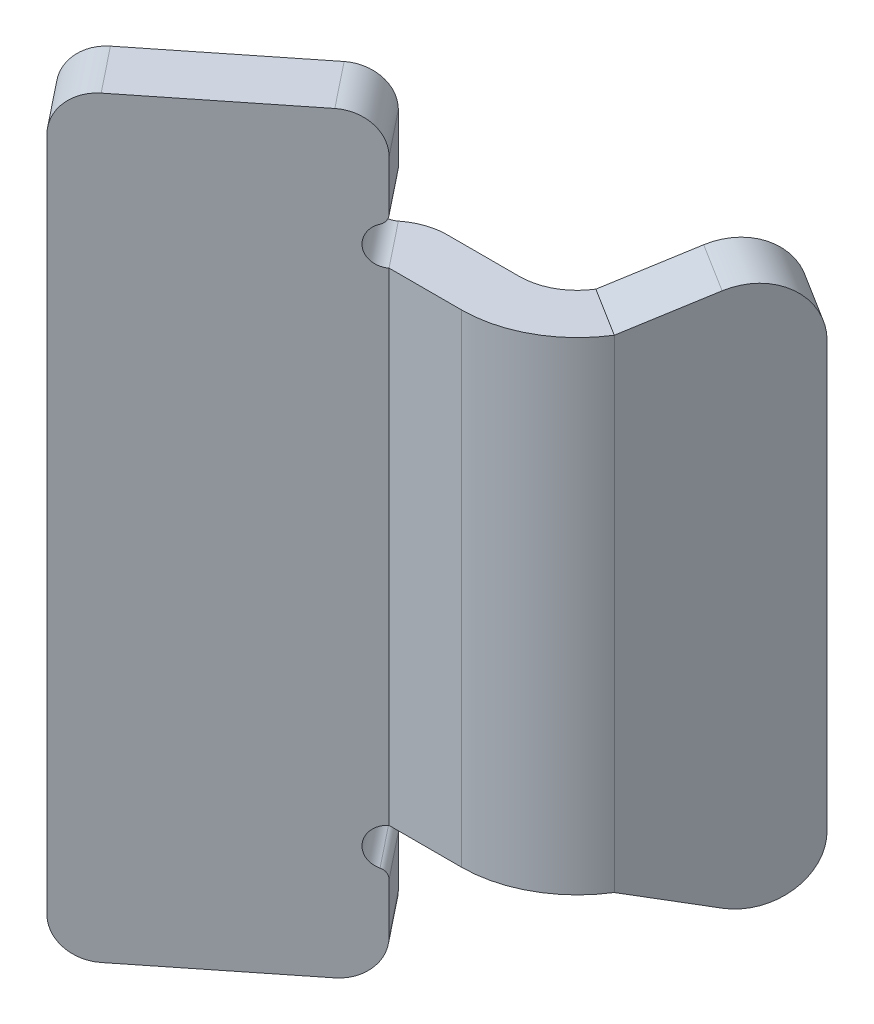
ISO-10303-21;
HEADER;
FILE_DESCRIPTION(('STEP AP214'),'2;1');
FILE_NAME('part.step','',(''),(''),'','','');
FILE_SCHEMA(('AUTOMOTIVE_DESIGN { 1 0 10303 214 1 1 1 1 }'));
ENDSEC;
DATA;
#1=APPLICATION_CONTEXT('core data for automotive mechanical design processes');
#2=APPLICATION_PROTOCOL_DEFINITION('international standard','automotive_design',2000,#1);
#3=PRODUCT_CONTEXT('',#1,'mechanical');
#4=PRODUCT('Part','Part','',(#3));
#5=PRODUCT_RELATED_PRODUCT_CATEGORY('part','',(#4));
#6=PRODUCT_DEFINITION_FORMATION('','',#4);
#7=PRODUCT_DEFINITION_CONTEXT('part definition',#1,'design');
#8=PRODUCT_DEFINITION('design','',#6,#7);
#9=PRODUCT_DEFINITION_SHAPE('','',#8);
#10=(LENGTH_UNIT() NAMED_UNIT(*) SI_UNIT(.MILLI.,.METRE.));
#11=(NAMED_UNIT(*) PLANE_ANGLE_UNIT() SI_UNIT($,.RADIAN.));
#12=(NAMED_UNIT(*) SI_UNIT($,.STERADIAN.) SOLID_ANGLE_UNIT());
#13=UNCERTAINTY_MEASURE_WITH_UNIT(LENGTH_MEASURE(1.E-05),#10,'distance_accuracy_value','');
#14=(GEOMETRIC_REPRESENTATION_CONTEXT(3) GLOBAL_UNCERTAINTY_ASSIGNED_CONTEXT((#13)) GLOBAL_UNIT_ASSIGNED_CONTEXT((#10,
#11,#12)) REPRESENTATION_CONTEXT('',''));
#15=CARTESIAN_POINT('',(0.,0.,0.));
#16=DIRECTION('',(0.,0.,1.));
#17=DIRECTION('',(1.,0.,0.));
#18=AXIS2_PLACEMENT_3D('',#15,#16,#17);
#19=CARTESIAN_POINT('',(-21.75373898583,0.,-38.02220742052));
#20=DIRECTION('',(0.848048096156421,0.,0.529919264233213));
#21=DIRECTION('',(0.529919264233213,0.,-0.848048096156421));
#22=AXIS2_PLACEMENT_3D('',#19,#20,#21);
#23=PLANE('',#22);
#24=CARTESIAN_POINT('',(-41.9818376398863,41.75356883009,-5.65048268757589));
#25=DIRECTION('',(0.848048096156421,0.,0.529919264233213));
#26=DIRECTION('',(0.529919264233213,0.,-0.848048096156421));
#27=AXIS2_PLACEMENT_3D('',#24,#25,#26);
#28=CIRCLE('',#27,3.000000000598);
#29=CARTESIAN_POINT('',(-40.3920798468706,41.75356883009,-8.19462697655104));
#30=VERTEX_POINT('',#29);
#31=CARTESIAN_POINT('',(-42.4830924837084,44.6005423384936,-4.84830725315945));
#32=VERTEX_POINT('',#31);
#33=EDGE_CURVE('E177',#30,#32,#28,.T.);
#34=ORIENTED_EDGE('',*,*,#33,.F.);
#35=DIRECTION('',(0.,1.,0.));
#36=VECTOR('',#35,1.);
#37=CARTESIAN_POINT('',(-40.3920798468714,30.75356883068,-8.19462697654979));
#38=LINE('',#37,#36);
#39=CARTESIAN_POINT('',(-40.3920798468719,19.75356883128,-8.19462697655009));
#40=VERTEX_POINT('',#39);
#41=EDGE_CURVE('E173',#30,#40,#38,.F.);
#42=ORIENTED_EDGE('',*,*,#41,.T.);
#43=CARTESIAN_POINT('',(-41.9818376398873,19.75356883128,-5.6504826875765));
#44=DIRECTION('',(0.848048096156421,0.,0.529919264233213));
#45=DIRECTION('',(0.529919264233213,0.,-0.848048096156421));
#46=AXIS2_PLACEMENT_3D('',#43,#44,#45);
#47=CIRCLE('',#46,3.000000000598);
#48=CARTESIAN_POINT('',(-42.4830924837089,16.9065953228764,-4.8483072531598));
#49=VERTEX_POINT('',#48);
#50=EDGE_CURVE('E20',#49,#40,#47,.T.);
#51=ORIENTED_EDGE('',*,*,#50,.F.);
#52=DIRECTION('',(-0.502888702188584,0.315302649260106,0.804790154376059));
#53=VECTOR('',#52,1.);
#54=CARTESIAN_POINT('',(-42.4830924837105,16.9065953228774,-4.84830725315725));
#55=LINE('',#54,#53);
#56=CARTESIAN_POINT('',(-44.6314339607378,18.2535688306815,-1.41024220730392));
#57=VERTEX_POINT('',#56);
#58=EDGE_CURVE('E168',#49,#57,#55,.T.);
#59=ORIENTED_EDGE('',*,*,#58,.T.);
#60=DIRECTION('',(0.,1.,0.));
#61=VECTOR('',#60,1.);
#62=CARTESIAN_POINT('',(-44.6314339607407,18.25356883068,-1.41024220730043));
#63=LINE('',#62,#61);
#64=CARTESIAN_POINT('',(-44.6314339607458,43.2535688306835,-1.41024220729116));
#65=VERTEX_POINT('',#64);
#66=EDGE_CURVE('E291',#57,#65,#63,.T.);
#67=ORIENTED_EDGE('',*,*,#66,.T.);
#68=DIRECTION('',(0.502888702188584,0.315302649260106,-0.804790154376059));
#69=VECTOR('',#68,1.);
#70=CARTESIAN_POINT('',(-44.6314339607411,43.2535688306863,-1.41024220729822));
#71=LINE('',#70,#69);
#72=EDGE_CURVE('E285',#65,#32,#71,.T.);
#73=ORIENTED_EDGE('',*,*,#72,.T.);
#74=EDGE_LOOP('',(#34,#42,#51,#59,#67,#73));
#75=FACE_BOUND('',#74,.T.);
#76=ADVANCED_FACE('F17',(#75),#23,.F.);
#77=CARTESIAN_POINT('',(-42.28519107799,17.58008207678,-2.334395833879));
#78=DIRECTION('',(0.167084947906703,0.948991169279018,-0.267391811418105));
#79=DIRECTION('',(0.,0.271204264419381,0.962521816355734));
#80=AXIS2_PLACEMENT_3D('',#77,#78,#79);
#81=PLANE('',#80);
#82=DIRECTION('',(0.848048096156421,0.,0.529919264233213));
#83=VECTOR('',#82,1.);
#84=CARTESIAN_POINT('',(-41.2110203394731,16.9065953228774,-4.05342835680583));
#85=LINE('',#84,#83);
#86=CARTESIAN_POINT('',(-39.9389481952388,16.9065953228778,-3.25854946046256));
#87=VERTEX_POINT('',#86);
#88=EDGE_CURVE('E187',#87,#49,#85,.F.);
#89=ORIENTED_EDGE('',*,*,#88,.F.);
#90=DIRECTION('',(0.502888702188366,-0.315302649258903,-0.804790154376666));
#91=VECTOR('',#90,1.);
#92=CARTESIAN_POINT('',(-42.0872896722712,18.25356883068,0.179515585398478));
#93=LINE('',#92,#91);
#94=CARTESIAN_POINT('',(-42.0872896722711,18.25356883068,0.179515585398518));
#95=VERTEX_POINT('',#94);
#96=EDGE_CURVE('E282',#95,#87,#93,.T.);
#97=ORIENTED_EDGE('',*,*,#96,.F.);
#98=DIRECTION('',(-0.848048096156555,0.,-0.529919264232998));
#99=VECTOR('',#98,1.);
#100=CARTESIAN_POINT('',(-42.08728967227,18.25356883068,0.1795155853992));
#101=LINE('',#100,#99);
#102=EDGE_CURVE('E284',#95,#57,#101,.T.);
#103=ORIENTED_EDGE('',*,*,#102,.T.);
#104=ORIENTED_EDGE('',*,*,#58,.F.);
#105=EDGE_LOOP('',(#89,#97,#103,#104));
#106=FACE_BOUND('',#105,.T.);
#107=ADVANCED_FACE('F638',(#106),#81,.F.);
#108=CARTESIAN_POINT('',(-40.70976549565,19.75356883128,-4.855603791225));
#109=DIRECTION('',(0.848048096156421,0.,0.529919264233213));
#110=DIRECTION('',(0.529919264233213,0.,-0.848048096156421));
#111=AXIS2_PLACEMENT_3D('',#108,#109,#110);
#112=CYLINDRICAL_SURFACE('',#111,3.000000000598);
#113=ORIENTED_EDGE('',*,*,#88,.T.);
#114=ORIENTED_EDGE('',*,*,#50,.T.);
#115=DIRECTION('',(0.848048096156421,0.,0.529919264233213));
#116=VECTOR('',#115,1.);
#117=CARTESIAN_POINT('',(-39.12000770264,19.75356883128,-7.399748080202));
#118=LINE('',#117,#116);
#119=CARTESIAN_POINT('',(-37.8479355584032,19.75356883128,-6.60486918385164));
#120=VERTEX_POINT('',#119);
#121=EDGE_CURVE('E181',#40,#120,#118,.T.);
#122=ORIENTED_EDGE('',*,*,#121,.T.);
#123=CARTESIAN_POINT('',(-39.4376933514164,19.75356883128,-4.06072489487583));
#124=DIRECTION('',(0.848048096156421,0.,0.529919264233213));
#125=DIRECTION('',(0.529919264233213,0.,-0.848048096156421));
#126=AXIS2_PLACEMENT_3D('',#123,#124,#125);
#127=CIRCLE('',#126,3.000000000598);
#128=EDGE_CURVE('E280',#87,#120,#127,.T.);
#129=ORIENTED_EDGE('',*,*,#128,.F.);
#130=EDGE_LOOP('',(#113,#114,#122,#129));
#131=FACE_BOUND('',#130,.T.);
#132=ADVANCED_FACE('F184',(#131),#112,.T.);
#133=CARTESIAN_POINT('',(-39.12000770264,30.75356883068,-7.399748080202));
#134=DIRECTION('',(-0.529919264233213,0.,0.848048096156421));
#135=DIRECTION('',(0.848048096156421,0.,0.529919264233213));
#136=AXIS2_PLACEMENT_3D('',#133,#134,#135);
#137=PLANE('',#136);
#138=DIRECTION('',(0.,1.,0.));
#139=VECTOR('',#138,1.);
#140=CARTESIAN_POINT('',(-37.8479355584043,0.,-6.6048691838547));
#141=LINE('',#140,#139);
#142=CARTESIAN_POINT('',(-37.8479355584025,41.75356883009,-6.60486918385382));
#143=VERTEX_POINT('',#142);
#144=EDGE_CURVE('E190',#120,#143,#141,.T.);
#145=ORIENTED_EDGE('',*,*,#144,.F.);
#146=ORIENTED_EDGE('',*,*,#121,.F.);
#147=ORIENTED_EDGE('',*,*,#41,.F.);
#148=DIRECTION('',(0.848048096156421,0.,0.529919264233213));
#149=VECTOR('',#148,1.);
#150=CARTESIAN_POINT('',(-39.1200077026335,41.75356883009,-7.3997480802014));
#151=LINE('',#150,#149);
#152=EDGE_CURVE('E192',#143,#30,#151,.F.);
#153=ORIENTED_EDGE('',*,*,#152,.F.);
#154=EDGE_LOOP('',(#145,#146,#147,#153));
#155=FACE_BOUND('',#154,.T.);
#156=ADVANCED_FACE('F188',(#155),#137,.F.);
#157=CARTESIAN_POINT('',(-40.70976549565,41.75356883009,-4.855603791225));
#158=DIRECTION('',(0.848048096156421,0.,0.529919264233213));
#159=DIRECTION('',(0.529919264233213,0.,-0.848048096156421));
#160=AXIS2_PLACEMENT_3D('',#157,#158,#159);
#161=CYLINDRICAL_SURFACE('',#160,3.000000000598);
#162=ORIENTED_EDGE('',*,*,#152,.T.);
#163=ORIENTED_EDGE('',*,*,#33,.T.);
#164=DIRECTION('',(0.848048096156434,0.,0.529919264233192));
#165=VECTOR('',#164,1.);
#166=CARTESIAN_POINT('',(-42.4830924837105,44.6005423384927,-4.84830725315725));
#167=LINE('',#166,#165);
#168=CARTESIAN_POINT('',(-39.938948195241,44.6005423384912,-3.25854946046018));
#169=VERTEX_POINT('',#168);
#170=EDGE_CURVE('E288',#32,#169,#167,.T.);
#171=ORIENTED_EDGE('',*,*,#170,.T.);
#172=CARTESIAN_POINT('',(-39.4376933514174,41.75356883009,-4.06072489487643));
#173=DIRECTION('',(0.848048096156421,0.,0.529919264233213));
#174=DIRECTION('',(0.529919264233213,0.,-0.848048096156421));
#175=AXIS2_PLACEMENT_3D('',#172,#173,#174);
#176=CIRCLE('',#175,3.000000000598);
#177=EDGE_CURVE('E276',#143,#169,#176,.T.);
#178=ORIENTED_EDGE('',*,*,#177,.F.);
#179=EDGE_LOOP('',(#162,#163,#171,#178));
#180=FACE_BOUND('',#179,.T.);
#181=ADVANCED_FACE('F612',(#180),#161,.T.);
#182=CARTESIAN_POINT('',(-42.28519107799,43.92705558459,-2.334395833879));
#183=DIRECTION('',(0.167084947906703,-0.948991169279018,-0.267391811418105));
#184=DIRECTION('',(0.,0.271204264419381,-0.962521816355734));
#185=AXIS2_PLACEMENT_3D('',#182,#183,#184);
#186=PLANE('',#185);
#187=ORIENTED_EDGE('',*,*,#170,.F.);
#188=ORIENTED_EDGE('',*,*,#72,.F.);
#189=DIRECTION('',(0.848048096156555,0.,0.529919264232998));
#190=VECTOR('',#189,1.);
#191=CARTESIAN_POINT('',(-44.63143396074,43.25356883068,-1.4102422073));
#192=LINE('',#191,#190);
#193=CARTESIAN_POINT('',(-42.0872896722711,43.25356883068,0.179515585398519));
#194=VERTEX_POINT('',#193);
#195=EDGE_CURVE('E275',#65,#194,#192,.T.);
#196=ORIENTED_EDGE('',*,*,#195,.T.);
#197=DIRECTION('',(-0.502888702187995,-0.31530264926101,0.804790154376072));
#198=VECTOR('',#197,1.);
#199=CARTESIAN_POINT('',(-39.9389481952433,44.60054233849,-3.2585494604601));
#200=LINE('',#199,#198);
#201=EDGE_CURVE('E279',#169,#194,#200,.T.);
#202=ORIENTED_EDGE('',*,*,#201,.F.);
#203=EDGE_LOOP('',(#187,#188,#196,#202));
#204=FACE_BOUND('',#203,.T.);
#205=ADVANCED_FACE('F602',(#204),#186,.F.);
#206=CARTESIAN_POINT('',(-47.17557824921,18.25356883068,-3.));
#207=DIRECTION('',(0.,1.,0.));
#208=DIRECTION('',(0.,0.,1.));
#209=AXIS2_PLACEMENT_3D('',#206,#207,#208);
#210=CYLINDRICAL_SURFACE('',#209,3.);
#211=DIRECTION('',(0.,1.,0.));
#212=VECTOR('',#211,1.);
#213=CARTESIAN_POINT('',(-47.17557824921,0.,0.));
#214=LINE('',#213,#212);
#215=CARTESIAN_POINT('',(-47.17557824921,18.25356883068,0.));
#216=VERTEX_POINT('',#215);
#217=CARTESIAN_POINT('',(-47.17557824921,43.25356883068,0.));
#218=VERTEX_POINT('',#217);
#219=EDGE_CURVE('E304',#216,#218,#214,.T.);
#220=ORIENTED_EDGE('',*,*,#219,.T.);
#221=CARTESIAN_POINT('',(-47.17557824921,43.25356883068,-3.));
#222=DIRECTION('',(0.,1.,0.));
#223=DIRECTION('',(0.,0.,1.));
#224=AXIS2_PLACEMENT_3D('',#221,#222,#223);
#225=CIRCLE('',#224,3.);
#226=EDGE_CURVE('E272',#218,#65,#225,.T.);
#227=ORIENTED_EDGE('',*,*,#226,.T.);
#228=ORIENTED_EDGE('',*,*,#66,.F.);
#229=CARTESIAN_POINT('',(-47.17557824921,18.25356883068,-3.));
#230=DIRECTION('',(0.,1.,0.));
#231=DIRECTION('',(0.,0.,1.));
#232=AXIS2_PLACEMENT_3D('',#229,#230,#231);
#233=CIRCLE('',#232,3.);
#234=EDGE_CURVE('E283',#57,#216,#233,.F.);
#235=ORIENTED_EDGE('',*,*,#234,.T.);
#236=EDGE_LOOP('',(#220,#227,#228,#235));
#237=FACE_BOUND('',#236,.T.);
#238=ADVANCED_FACE('F592',(#237),#210,.F.);
#239=CARTESIAN_POINT('',(-19.20959469736,0.,-36.43244962782));
#240=DIRECTION('',(0.848048096156421,0.,0.529919264233213));
#241=DIRECTION('',(0.529919264233213,0.,-0.848048096156421));
#242=AXIS2_PLACEMENT_3D('',#239,#240,#241);
#243=PLANE('',#242);
#244=ORIENTED_EDGE('',*,*,#201,.T.);
#245=DIRECTION('',(0.,1.,0.));
#246=VECTOR('',#245,1.);
#247=CARTESIAN_POINT('',(-42.087289672271,18.25356883068,0.179515585398561));
#248=LINE('',#247,#246);
#249=EDGE_CURVE('E263',#95,#194,#248,.T.);
#250=ORIENTED_EDGE('',*,*,#249,.F.);
#251=ORIENTED_EDGE('',*,*,#96,.T.);
#252=ORIENTED_EDGE('',*,*,#128,.T.);
#253=ORIENTED_EDGE('',*,*,#144,.T.);
#254=ORIENTED_EDGE('',*,*,#177,.T.);
#255=EDGE_LOOP('',(#244,#250,#251,#252,#253,#254));
#256=FACE_BOUND('',#255,.T.);
#257=ADVANCED_FACE('F582',(#256),#243,.T.);
#258=CARTESIAN_POINT('',(0.,0.,0.));
#259=DIRECTION('',(0.,0.,1.));
#260=DIRECTION('',(1.,0.,0.));
#261=AXIS2_PLACEMENT_3D('',#258,#259,#260);
#262=PLANE('',#261);
#263=ORIENTED_EDGE('',*,*,#219,.F.);
#264=DIRECTION('',(1.,0.,0.));
#265=VECTOR('',#264,1.);
#266=CARTESIAN_POINT('',(-47.37203868445,18.25356883068,0.));
#267=LINE('',#266,#265);
#268=CARTESIAN_POINT('',(-50.93037201773,18.25356883068,0.));
#269=VERTEX_POINT('',#268);
#270=EDGE_CURVE('E266',#216,#269,#267,.F.);
#271=ORIENTED_EDGE('',*,*,#270,.T.);
#272=DIRECTION('',(0.,-1.,0.));
#273=VECTOR('',#272,1.);
#274=CARTESIAN_POINT('',(-50.93037201773,44.00318695362,0.));
#275=LINE('',#274,#273);
#276=CARTESIAN_POINT('',(-50.93037201773,43.25356883068,0.));
#277=VERTEX_POINT('',#276);
#278=EDGE_CURVE('E271',#277,#269,#275,.T.);
#279=ORIENTED_EDGE('',*,*,#278,.F.);
#280=DIRECTION('',(1.,0.,0.));
#281=VECTOR('',#280,1.);
#282=CARTESIAN_POINT('',(-47.37203868445,43.25356883068,0.));
#283=LINE('',#282,#281);
#284=EDGE_CURVE('E259',#277,#218,#283,.T.);
#285=ORIENTED_EDGE('',*,*,#284,.T.);
#286=EDGE_LOOP('',(#263,#271,#279,#285));
#287=FACE_BOUND('',#286,.T.);
#288=ADVANCED_FACE('F572',(#287),#262,.F.);
#289=CARTESIAN_POINT('',(-50.93037201773,44.00318695362,3.));
#290=DIRECTION('',(0.,-1.,0.));
#291=DIRECTION('',(0.,0.,-1.));
#292=AXIS2_PLACEMENT_3D('',#289,#290,#291);
#293=CYLINDRICAL_SURFACE('',#292,3.);
#294=CARTESIAN_POINT('',(-50.93037201773,18.25356883068,3.));
#295=DIRECTION('',(0.,-1.,0.));
#296=DIRECTION('',(0.,0.,-1.));
#297=AXIS2_PLACEMENT_3D('',#294,#295,#296);
#298=CIRCLE('',#297,3.);
#299=CARTESIAN_POINT('',(-52.7979159276552,18.2535688306812,0.65217552944833));
#300=VERTEX_POINT('',#299);
#301=EDGE_CURVE('E269',#269,#300,#298,.F.);
#302=ORIENTED_EDGE('',*,*,#301,.T.);
#303=DIRECTION('',(0.,1.,0.));
#304=VECTOR('',#303,1.);
#305=CARTESIAN_POINT('',(-52.7979159276512,0.,0.652175529441301));
#306=LINE('',#305,#304);
#307=CARTESIAN_POINT('',(-52.7979159276574,43.2535688306863,0.652175529450065));
#308=VERTEX_POINT('',#307);
#309=EDGE_CURVE('E251',#300,#308,#306,.T.);
#310=ORIENTED_EDGE('',*,*,#309,.T.);
#311=CARTESIAN_POINT('',(-50.93037201773,43.25356883068,3.));
#312=DIRECTION('',(0.,-1.,0.));
#313=DIRECTION('',(0.,0.,-1.));
#314=AXIS2_PLACEMENT_3D('',#311,#312,#313);
#315=CIRCLE('',#314,3.);
#316=EDGE_CURVE('E256',#308,#277,#315,.T.);
#317=ORIENTED_EDGE('',*,*,#316,.T.);
#318=ORIENTED_EDGE('',*,*,#278,.T.);
#319=EDGE_LOOP('',(#302,#310,#317,#318));
#320=FACE_BOUND('',#319,.T.);
#321=ADVANCED_FACE('F562',(#320),#293,.T.);
#322=CARTESIAN_POINT('',(-52.25542414563,15.83937686888,2.137326067759));
#323=DIRECTION('',(0.622514636637614,0.,0.782608156852418));
#324=DIRECTION('',(0.782608156852418,0.,-0.622514636637614));
#325=AXIS2_PLACEMENT_3D('',#322,#323,#324);
#326=CYLINDRICAL_SURFACE('',#325,0.4999694541291);
#327=DIRECTION('',(0.622514636637614,0.,0.782608156852418));
#328=VECTOR('',#327,1.);
#329=CARTESIAN_POINT('',(-51.8641439726531,15.83937686886,1.82608776469167));
#330=LINE('',#329,#328);
#331=CARTESIAN_POINT('',(-50.9303720177332,15.83937686887,2.99999999999977));
#332=VERTEX_POINT('',#331);
#333=CARTESIAN_POINT('',(-52.7979159276095,15.8393768688609,0.652175529413034));
#334=VERTEX_POINT('',#333);
#335=EDGE_CURVE('E333',#332,#334,#330,.F.);
#336=ORIENTED_EDGE('',*,*,#335,.T.);
#337=CARTESIAN_POINT('',(-53.1891961005872,15.83937686888,0.963413832479435));
#338=DIRECTION('',(0.622514636637614,0.,0.782608156852418));
#339=DIRECTION('',(0.782608156852418,0.,-0.622514636637614));
#340=AXIS2_PLACEMENT_3D('',#337,#338,#339);
#341=CIRCLE('',#340,0.4999694541291);
#342=CARTESIAN_POINT('',(-53.0587872627011,16.3107606705521,0.859681958972732));
#343=VERTEX_POINT('',#342);
#344=EDGE_CURVE('E252',#334,#343,#341,.T.);
#345=ORIENTED_EDGE('',*,*,#344,.T.);
#346=DIRECTION('',(-0.622514636637614,0.,-0.782608156852418));
#347=VECTOR('',#346,1.);
#348=CARTESIAN_POINT('',(-52.1250153077458,16.310760670549,2.03359419425167));
#349=LINE('',#348,#347);
#350=CARTESIAN_POINT('',(-51.1912433527875,16.3107606705521,3.20750642953098));
#351=VERTEX_POINT('',#350);
#352=EDGE_CURVE('E238',#343,#351,#349,.F.);
#353=ORIENTED_EDGE('',*,*,#352,.T.);
#354=CARTESIAN_POINT('',(-51.3216521906741,15.83937686888,3.31123830303694));
#355=DIRECTION('',(0.622514636637614,0.,0.782608156852418));
#356=DIRECTION('',(0.782608156852418,0.,-0.622514636637614));
#357=AXIS2_PLACEMENT_3D('',#354,#355,#356);
#358=CIRCLE('',#357,0.4999694541291);
#359=EDGE_CURVE('E267',#351,#332,#358,.F.);
#360=ORIENTED_EDGE('',*,*,#359,.T.);
#361=EDGE_LOOP('',(#336,#345,#353,#360));
#362=FACE_BOUND('',#361,.T.);
#363=ADVANCED_FACE('F552',(#362),#326,.T.);
#364=CARTESIAN_POINT('',(-47.37203868445,18.25356883068,1.5));
#365=DIRECTION('',(0.,1.,0.));
#366=DIRECTION('',(0.,0.,1.));
#367=AXIS2_PLACEMENT_3D('',#364,#365,#366);
#368=PLANE('',#367);
#369=ORIENTED_EDGE('',*,*,#270,.F.);
#370=ORIENTED_EDGE('',*,*,#234,.F.);
#371=ORIENTED_EDGE('',*,*,#102,.F.);
#372=CARTESIAN_POINT('',(-47.17557824921,18.25356883068,-3.));
#373=DIRECTION('',(0.,1.,0.));
#374=DIRECTION('',(0.,0.,1.));
#375=AXIS2_PLACEMENT_3D('',#372,#373,#374);
#376=CIRCLE('',#375,6.);
#377=CARTESIAN_POINT('',(-47.17557824921,18.253568830685,3.));
#378=VERTEX_POINT('',#377);
#379=EDGE_CURVE('E260',#378,#95,#376,.T.);
#380=ORIENTED_EDGE('',*,*,#379,.F.);
#381=DIRECTION('',(1.,0.,0.));
#382=VECTOR('',#381,1.);
#383=CARTESIAN_POINT('',(0.,18.25356883069,3.));
#384=LINE('',#383,#382);
#385=CARTESIAN_POINT('',(-50.9303720177318,18.253568830685,2.9999999999986));
#386=VERTEX_POINT('',#385);
#387=EDGE_CURVE('E318',#386,#378,#384,.T.);
#388=ORIENTED_EDGE('',*,*,#387,.F.);
#389=DIRECTION('',(-0.622514636637614,0.,-0.782608156852418));
#390=VECTOR('',#389,1.);
#391=CARTESIAN_POINT('',(-51.8641439726889,18.2535688306816,1.82608776471829));
#392=LINE('',#391,#390);
#393=EDGE_CURVE('E239',#386,#300,#392,.T.);
#394=ORIENTED_EDGE('',*,*,#393,.T.);
#395=ORIENTED_EDGE('',*,*,#301,.F.);
#396=EDGE_LOOP('',(#369,#370,#371,#380,#388,#394,#395));
#397=FACE_BOUND('',#396,.T.);
#398=ADVANCED_FACE('F542',(#397),#368,.F.);
#399=CARTESIAN_POINT('',(-47.17557824921,18.25356883068,-3.));
#400=DIRECTION('',(0.,1.,0.));
#401=DIRECTION('',(0.,0.,1.));
#402=AXIS2_PLACEMENT_3D('',#399,#400,#401);
#403=CYLINDRICAL_SURFACE('',#402,6.);
#404=ORIENTED_EDGE('',*,*,#379,.T.);
#405=ORIENTED_EDGE('',*,*,#249,.T.);
#406=CARTESIAN_POINT('',(-47.17557824921,43.25356883068,-3.));
#407=DIRECTION('',(0.,1.,0.));
#408=DIRECTION('',(0.,0.,1.));
#409=AXIS2_PLACEMENT_3D('',#406,#407,#408);
#410=CIRCLE('',#409,6.);
#411=CARTESIAN_POINT('',(-47.17557824921,43.25356883068,3.));
#412=VERTEX_POINT('',#411);
#413=EDGE_CURVE('E264',#194,#412,#410,.F.);
#414=ORIENTED_EDGE('',*,*,#413,.T.);
#415=DIRECTION('',(0.,1.,0.));
#416=VECTOR('',#415,1.);
#417=CARTESIAN_POINT('',(-47.17557824921,0.,3.));
#418=LINE('',#417,#416);
#419=EDGE_CURVE('E314',#378,#412,#418,.T.);
#420=ORIENTED_EDGE('',*,*,#419,.F.);
#421=EDGE_LOOP('',(#404,#405,#414,#420));
#422=FACE_BOUND('',#421,.T.);
#423=ADVANCED_FACE('F532',(#422),#403,.T.);
#424=CARTESIAN_POINT('',(-47.37203868445,43.25356883068,1.5));
#425=DIRECTION('',(0.,-1.,0.));
#426=DIRECTION('',(0.,0.,-1.));
#427=AXIS2_PLACEMENT_3D('',#424,#425,#426);
#428=PLANE('',#427);
#429=ORIENTED_EDGE('',*,*,#316,.F.);
#430=DIRECTION('',(-0.622514636637614,0.,-0.782608156852418));
#431=VECTOR('',#430,1.);
#432=CARTESIAN_POINT('',(-51.8641439726933,43.2535688306884,1.8260877647218));
#433=LINE('',#432,#431);
#434=CARTESIAN_POINT('',(-50.9303720177336,43.2535688306842,3.00000000000453));
#435=VERTEX_POINT('',#434);
#436=EDGE_CURVE('E343',#308,#435,#433,.F.);
#437=ORIENTED_EDGE('',*,*,#436,.T.);
#438=DIRECTION('',(1.,0.,0.));
#439=VECTOR('',#438,1.);
#440=CARTESIAN_POINT('',(0.,43.25356883068,3.));
#441=LINE('',#440,#439);
#442=EDGE_CURVE('E317',#412,#435,#441,.F.);
#443=ORIENTED_EDGE('',*,*,#442,.F.);
#444=ORIENTED_EDGE('',*,*,#413,.F.);
#445=ORIENTED_EDGE('',*,*,#195,.F.);
#446=ORIENTED_EDGE('',*,*,#226,.F.);
#447=ORIENTED_EDGE('',*,*,#284,.F.);
#448=EDGE_LOOP('',(#429,#437,#443,#444,#445,#446,#447));
#449=FACE_BOUND('',#448,.T.);
#450=ADVANCED_FACE('F522',(#449),#428,.F.);
#451=CARTESIAN_POINT('',(-52.25542414563,45.66776079249,2.137326067759));
#452=DIRECTION('',(0.622514636637614,0.,0.782608156852418));
#453=DIRECTION('',(0.782608156852418,0.,-0.622514636637614));
#454=AXIS2_PLACEMENT_3D('',#451,#452,#453);
#455=CYLINDRICAL_SURFACE('',#454,0.4999694541291);
#456=DIRECTION('',(-0.622514636637614,0.,-0.782608156852418));
#457=VECTOR('',#456,1.);
#458=CARTESIAN_POINT('',(-52.1250153077476,45.1963769908202,2.03359419425306));
#459=LINE('',#458,#457);
#460=CARTESIAN_POINT('',(-51.1912433527891,45.1963769908171,3.20750642953251));
#461=VERTEX_POINT('',#460);
#462=CARTESIAN_POINT('',(-53.0587872627011,45.1963769908171,0.859681958976287));
#463=VERTEX_POINT('',#462);
#464=EDGE_CURVE('E234',#461,#463,#459,.T.);
#465=ORIENTED_EDGE('',*,*,#464,.T.);
#466=CARTESIAN_POINT('',(-53.189196100586,45.66776079249,0.963413832480863));
#467=DIRECTION('',(0.622514636637614,0.,0.782608156852418));
#468=DIRECTION('',(0.782608156852418,0.,-0.622514636637614));
#469=AXIS2_PLACEMENT_3D('',#466,#467,#468);
#470=CIRCLE('',#469,0.4999694541291);
#471=CARTESIAN_POINT('',(-52.7979159276082,45.6677607925091,0.652175529414672));
#472=VERTEX_POINT('',#471);
#473=EDGE_CURVE('E249',#463,#472,#470,.T.);
#474=ORIENTED_EDGE('',*,*,#473,.T.);
#475=DIRECTION('',(0.622514636637614,0.,0.782608156852418));
#476=VECTOR('',#475,1.);
#477=CARTESIAN_POINT('',(-51.8641439726531,45.66776079251,1.82608776469166));
#478=LINE('',#477,#476);
#479=CARTESIAN_POINT('',(-50.9303720176981,45.6677607925,2.99999999997221));
#480=VERTEX_POINT('',#479);
#481=EDGE_CURVE('E321',#472,#480,#478,.T.);
#482=ORIENTED_EDGE('',*,*,#481,.T.);
#483=CARTESIAN_POINT('',(-51.3216521906753,45.66776079249,3.31123830303552));
#484=DIRECTION('',(0.622514636637614,0.,0.782608156852418));
#485=DIRECTION('',(0.782608156852418,0.,-0.622514636637614));
#486=AXIS2_PLACEMENT_3D('',#483,#484,#485);
#487=CIRCLE('',#486,0.4999694541291);
#488=EDGE_CURVE('E254',#480,#461,#487,.F.);
#489=ORIENTED_EDGE('',*,*,#488,.T.);
#490=EDGE_LOOP('',(#465,#474,#482,#489));
#491=FACE_BOUND('',#490,.T.);
#492=ADVANCED_FACE('F512',(#491),#455,.T.);
#493=CARTESIAN_POINT('',(-12.43721778773,0.,-31.45217339284));
#494=DIRECTION('',(0.622514636637614,0.,0.782608156852418));
#495=DIRECTION('',(0.782608156852418,0.,-0.622514636637614));
#496=AXIS2_PLACEMENT_3D('',#493,#494,#495);
#497=PLANE('',#496);
#498=DIRECTION('',(0.,1.,0.));
#499=VECTOR('',#498,1.);
#500=CARTESIAN_POINT('',(-62.6693570064375,15.25356883073,8.50427431278401));
#501=LINE('',#500,#499);
#502=CARTESIAN_POINT('',(-62.6693570064381,48.25356883069,8.50427431278321));
#503=VERTEX_POINT('',#502);
#504=CARTESIAN_POINT('',(-62.6693570064375,13.25356883068,8.50427431278401));
#505=VERTEX_POINT('',#504);
#506=EDGE_CURVE('E221',#503,#505,#501,.F.);
#507=ORIENTED_EDGE('',*,*,#506,.F.);
#508=CARTESIAN_POINT('',(-61.104140692738,48.25356883069,7.2592450395104));
#509=DIRECTION('',(0.622514636637614,0.,0.782608156852418));
#510=DIRECTION('',(0.782608156852418,0.,-0.622514636637614));
#511=AXIS2_PLACEMENT_3D('',#508,#509,#510);
#512=CIRCLE('',#511,1.999999999998);
#513=CARTESIAN_POINT('',(-61.1041406927367,50.253568830684,7.25924503950941));
#514=VERTEX_POINT('',#513);
#515=EDGE_CURVE('E222',#514,#503,#512,.T.);
#516=ORIENTED_EDGE('',*,*,#515,.F.);
#517=DIRECTION('',(0.782608156852361,0.,-0.622514636637686));
#518=VECTOR('',#517,1.);
#519=CARTESIAN_POINT('',(-61.10414069274,50.25356883068,7.259245039512));
#520=LINE('',#519,#518);
#521=CARTESIAN_POINT('',(-54.3631322421825,50.25356883068,1.89720480337906));
#522=VERTEX_POINT('',#521);
#523=EDGE_CURVE('E228',#514,#522,#520,.T.);
#524=ORIENTED_EDGE('',*,*,#523,.T.);
#525=CARTESIAN_POINT('',(-54.363132241245,48.25356883049,1.89720480263612));
#526=DIRECTION('',(0.622514636637614,0.,0.782608156852418));
#527=DIRECTION('',(0.782608156852418,0.,-0.622514636637614));
#528=AXIS2_PLACEMENT_3D('',#525,#526,#527);
#529=CIRCLE('',#528,1.999999999819);
#530=CARTESIAN_POINT('',(-52.7979159276818,48.2535688305265,0.652175529473561));
#531=VERTEX_POINT('',#530);
#532=EDGE_CURVE('E225',#531,#522,#529,.T.);
#533=ORIENTED_EDGE('',*,*,#532,.F.);
#534=DIRECTION('',(-2.85263066977448E-11,1.,2.26908489172679E-11));
#535=VECTOR('',#534,1.);
#536=CARTESIAN_POINT('',(-52.797915927645,46.96066481122,0.652175529444219));
#537=LINE('',#536,#535);
#538=EDGE_CURVE('E233',#531,#472,#537,.F.);
#539=ORIENTED_EDGE('',*,*,#538,.T.);
#540=ORIENTED_EDGE('',*,*,#473,.F.);
#541=CARTESIAN_POINT('',(-52.7979159276844,44.25356883031,0.652175529474912));
#542=DIRECTION('',(-0.622514636637614,0.,-0.782608156852418));
#543=DIRECTION('',(-0.782608156852418,0.,0.622514636637614));
#544=AXIS2_PLACEMENT_3D('',#541,#542,#543);
#545=CIRCLE('',#544,0.9999999996216);
#546=EDGE_CURVE('E230',#463,#308,#545,.F.);
#547=ORIENTED_EDGE('',*,*,#546,.T.);
#548=ORIENTED_EDGE('',*,*,#309,.F.);
#549=CARTESIAN_POINT('',(-52.7979159276867,17.25356883106,0.652175529472001));
#550=DIRECTION('',(-0.622514636637614,0.,-0.782608156852418));
#551=DIRECTION('',(-0.782608156852418,0.,0.622514636637614));
#552=AXIS2_PLACEMENT_3D('',#549,#550,#551);
#553=CIRCLE('',#552,0.9999999996216);
#554=EDGE_CURVE('E235',#300,#343,#553,.F.);
#555=ORIENTED_EDGE('',*,*,#554,.T.);
#556=ORIENTED_EDGE('',*,*,#344,.F.);
#557=DIRECTION('',(2.85241562034601E-11,1.,-2.26891383368753E-11));
#558=VECTOR('',#557,1.);
#559=CARTESIAN_POINT('',(-52.7979159276464,14.54647285015,0.652175529442369));
#560=LINE('',#559,#558);
#561=CARTESIAN_POINT('',(-52.7979159276841,13.2535688309336,0.652175529470771));
#562=VERTEX_POINT('',#561);
#563=EDGE_CURVE('E243',#334,#562,#560,.F.);
#564=ORIENTED_EDGE('',*,*,#563,.T.);
#565=CARTESIAN_POINT('',(-54.363132241248,13.2535688305,1.8972048026324));
#566=DIRECTION('',(0.622514636637614,0.,0.782608156852418));
#567=DIRECTION('',(0.782608156852418,0.,-0.622514636637614));
#568=AXIS2_PLACEMENT_3D('',#565,#566,#567);
#569=CIRCLE('',#568,1.999999999819);
#570=CARTESIAN_POINT('',(-54.363132241247,11.2535688306805,1.8972048026316));
#571=VERTEX_POINT('',#570);
#572=EDGE_CURVE('E240',#571,#562,#569,.T.);
#573=ORIENTED_EDGE('',*,*,#572,.F.);
#574=DIRECTION('',(-0.782608156852331,0.,0.622514636637724));
#575=VECTOR('',#574,1.);
#576=CARTESIAN_POINT('',(-54.36313224125,11.25356883068,1.897204802634));
#577=LINE('',#576,#575);
#578=CARTESIAN_POINT('',(-61.1041406927384,11.25356883068,7.259245039512));
#579=VERTEX_POINT('',#578);
#580=EDGE_CURVE('E248',#571,#579,#577,.T.);
#581=ORIENTED_EDGE('',*,*,#580,.T.);
#582=CARTESIAN_POINT('',(-61.1041406927367,13.25356883068,7.259245039512));
#583=DIRECTION('',(0.622514636637614,0.,0.782608156852418));
#584=DIRECTION('',(0.782608156852418,0.,-0.622514636637614));
#585=AXIS2_PLACEMENT_3D('',#582,#583,#584);
#586=CIRCLE('',#585,1.999999999998);
#587=EDGE_CURVE('E245',#505,#579,#586,.T.);
#588=ORIENTED_EDGE('',*,*,#587,.F.);
#589=EDGE_LOOP('',(#507,#516,#524,#533,#539,#540,#547,#548,#555,#556,#564,#573,#581,#588));
#590=FACE_BOUND('',#589,.T.);
#591=ADVANCED_FACE('F502',(#590),#497,.F.);
#592=CARTESIAN_POINT('',(-60.17036873778,13.25356883068,8.433157274791));
#593=DIRECTION('',(0.622514636637614,0.,0.782608156852418));
#594=DIRECTION('',(0.782608156852418,0.,-0.622514636637614));
#595=AXIS2_PLACEMENT_3D('',#592,#593,#594);
#596=CYLINDRICAL_SURFACE('',#595,1.999999999998);
#597=CARTESIAN_POINT('',(-59.2365967828225,13.25356883068,9.60706951007099));
#598=DIRECTION('',(0.622514636637614,0.,0.782608156852418));
#599=DIRECTION('',(0.782608156852418,0.,-0.622514636637614));
#600=AXIS2_PLACEMENT_3D('',#597,#598,#599);
#601=CIRCLE('',#600,1.999999999998);
#602=CARTESIAN_POINT('',(-60.8018130965246,13.25356883068,10.852098783344));
#603=VERTEX_POINT('',#602);
#604=CARTESIAN_POINT('',(-59.2365967828213,11.25356883068,9.60706951006988));
#605=VERTEX_POINT('',#604);
#606=EDGE_CURVE('E218',#603,#605,#601,.T.);
#607=ORIENTED_EDGE('',*,*,#606,.F.);
#608=DIRECTION('',(0.622514636637614,0.,0.782608156852418));
#609=VECTOR('',#608,1.);
#610=CARTESIAN_POINT('',(-61.73558505148,13.25356883068,9.678186548064));
#611=LINE('',#610,#609);
#612=EDGE_CURVE('E328',#505,#603,#611,.T.);
#613=ORIENTED_EDGE('',*,*,#612,.F.);
#614=ORIENTED_EDGE('',*,*,#587,.T.);
#615=DIRECTION('',(0.622514636639117,0.,0.782608156851223));
#616=VECTOR('',#615,1.);
#617=CARTESIAN_POINT('',(-61.10414069274,11.25356883068,7.259245039512));
#618=LINE('',#617,#616);
#619=EDGE_CURVE('E311',#579,#605,#618,.T.);
#620=ORIENTED_EDGE('',*,*,#619,.T.);
#621=EDGE_LOOP('',(#607,#613,#614,#620));
#622=FACE_BOUND('',#621,.T.);
#623=ADVANCED_FACE('F492',(#622),#596,.T.);
#624=CARTESIAN_POINT('',(-56.79986451203,11.25356883068,5.752137156352));
#625=DIRECTION('',(0.,1.,0.));
#626=DIRECTION('',(0.,0.,1.));
#627=AXIS2_PLACEMENT_3D('',#624,#625,#626);
#628=PLANE('',#627);
#629=DIRECTION('',(0.782608156852418,0.,-0.622514636637614));
#630=VECTOR('',#629,1.);
#631=CARTESIAN_POINT('',(-10.56967387781,11.25356883068,-29.10434892228));
#632=LINE('',#631,#630);
#633=CARTESIAN_POINT('',(-52.4955883313317,11.2535688306803,4.24502927319194));
#634=VERTEX_POINT('',#633);
#635=EDGE_CURVE('E217',#605,#634,#632,.T.);
#636=ORIENTED_EDGE('',*,*,#635,.F.);
#637=ORIENTED_EDGE('',*,*,#619,.F.);
#638=ORIENTED_EDGE('',*,*,#580,.F.);
#639=DIRECTION('',(0.622514636637614,0.,0.782608156852418));
#640=VECTOR('',#639,1.);
#641=CARTESIAN_POINT('',(-53.429360286288,11.253568830681,3.0711170379114));
#642=LINE('',#641,#640);
#643=EDGE_CURVE('E244',#634,#571,#642,.F.);
#644=ORIENTED_EDGE('',*,*,#643,.F.);
#645=EDGE_LOOP('',(#636,#637,#638,#644));
#646=FACE_BOUND('',#645,.T.);
#647=ADVANCED_FACE('F482',(#646),#628,.F.);
#648=CARTESIAN_POINT('',(-53.42936028629,13.2535688305,3.071117037913));
#649=DIRECTION('',(0.622514636637614,0.,0.782608156852418));
#650=DIRECTION('',(0.782608156852418,0.,-0.622514636637614));
#651=AXIS2_PLACEMENT_3D('',#648,#649,#650);
#652=CYLINDRICAL_SURFACE('',#651,1.999999999819);
#653=ORIENTED_EDGE('',*,*,#643,.T.);
#654=ORIENTED_EDGE('',*,*,#572,.T.);
#655=DIRECTION('',(0.622514636637614,0.,0.782608156852418));
#656=VECTOR('',#655,1.);
#657=CARTESIAN_POINT('',(-51.8641439727269,13.25356883144,1.82608776475034));
#658=LINE('',#657,#656);
#659=CARTESIAN_POINT('',(-50.9303720177693,13.25356883097,3.00000000003002));
#660=VERTEX_POINT('',#659);
#661=EDGE_CURVE('E313',#562,#660,#658,.T.);
#662=ORIENTED_EDGE('',*,*,#661,.T.);
#663=CARTESIAN_POINT('',(-52.4955883313335,13.2535688305,4.24502927319177));
#664=DIRECTION('',(0.622514636637614,0.,0.782608156852418));
#665=DIRECTION('',(0.782608156852418,0.,-0.622514636637614));
#666=AXIS2_PLACEMENT_3D('',#663,#664,#665);
#667=CIRCLE('',#666,1.999999999819);
#668=EDGE_CURVE('E214',#634,#660,#667,.T.);
#669=ORIENTED_EDGE('',*,*,#668,.F.);
#670=EDGE_LOOP('',(#653,#654,#662,#669));
#671=FACE_BOUND('',#670,.T.);
#672=ADVANCED_FACE('F472',(#671),#652,.T.);
#673=CARTESIAN_POINT('',(-51.86414397269,14.54647285015,1.826087764721));
#674=DIRECTION('',(-0.782608156852418,3.64475580195608E-11,0.622514636637614));
#675=DIRECTION('',(0.622514636637614,0.,0.782608156852418));
#676=AXIS2_PLACEMENT_3D('',#673,#674,#675);
#677=PLANE('',#676);
#678=DIRECTION('',(0.,1.,0.));
#679=VECTOR('',#678,1.);
#680=CARTESIAN_POINT('',(-50.9303720177685,0.,3.00000000003093));
#681=LINE('',#680,#679);
#682=EDGE_CURVE('E213',#660,#332,#681,.T.);
#683=ORIENTED_EDGE('',*,*,#682,.F.);
#684=ORIENTED_EDGE('',*,*,#661,.F.);
#685=ORIENTED_EDGE('',*,*,#563,.F.);
#686=ORIENTED_EDGE('',*,*,#335,.F.);
#687=EDGE_LOOP('',(#683,#684,#685,#686));
#688=FACE_BOUND('',#687,.T.);
#689=ADVANCED_FACE('F462',(#688),#677,.F.);
#690=CARTESIAN_POINT('',(-51.86414397273,17.25356883106,1.826087764751));
#691=DIRECTION('',(-0.622514636637614,0.,-0.782608156852418));
#692=DIRECTION('',(-0.782608156852418,0.,0.622514636637614));
#693=AXIS2_PLACEMENT_3D('',#690,#691,#692);
#694=CYLINDRICAL_SURFACE('',#693,0.9999999996216);
#695=ORIENTED_EDGE('',*,*,#352,.F.);
#696=ORIENTED_EDGE('',*,*,#554,.F.);
#697=ORIENTED_EDGE('',*,*,#393,.F.);
#698=CARTESIAN_POINT('',(-50.9303720177725,17.25356883106,3.00000000003099));
#699=DIRECTION('',(-0.622514636637614,0.,-0.782608156852418));
#700=DIRECTION('',(-0.782608156852418,0.,0.622514636637614));
#701=AXIS2_PLACEMENT_3D('',#698,#699,#700);
#702=CIRCLE('',#701,0.9999999996216);
#703=EDGE_CURVE('E210',#351,#386,#702,.T.);
#704=ORIENTED_EDGE('',*,*,#703,.F.);
#705=EDGE_LOOP('',(#695,#696,#697,#704));
#706=FACE_BOUND('',#705,.T.);
#707=ADVANCED_FACE('F452',(#706),#694,.F.);
#708=CARTESIAN_POINT('',(0.,0.,3.));
#709=DIRECTION('',(0.,0.,1.));
#710=DIRECTION('',(1.,0.,0.));
#711=AXIS2_PLACEMENT_3D('',#708,#709,#710);
#712=PLANE('',#711);
#713=ORIENTED_EDGE('',*,*,#442,.T.);
#714=DIRECTION('',(0.,1.,0.));
#715=VECTOR('',#714,1.);
#716=CARTESIAN_POINT('',(-50.9303720177298,0.,3.00000000000021));
#717=LINE('',#716,#715);
#718=EDGE_CURVE('E209',#386,#435,#717,.T.);
#719=ORIENTED_EDGE('',*,*,#718,.F.);
#720=ORIENTED_EDGE('',*,*,#387,.T.);
#721=ORIENTED_EDGE('',*,*,#419,.T.);
#722=EDGE_LOOP('',(#713,#719,#720,#721));
#723=FACE_BOUND('',#722,.T.);
#724=ADVANCED_FACE('F442',(#723),#712,.T.);
#725=CARTESIAN_POINT('',(-51.86414397273,44.25356883031,1.826087764751));
#726=DIRECTION('',(-0.622514636637614,0.,-0.782608156852418));
#727=DIRECTION('',(-0.782608156852418,0.,0.622514636637614));
#728=AXIS2_PLACEMENT_3D('',#725,#726,#727);
#729=CYLINDRICAL_SURFACE('',#728,0.9999999996216);
#730=ORIENTED_EDGE('',*,*,#464,.F.);
#731=CARTESIAN_POINT('',(-50.9303720177711,44.25356883031,3.00000000003271));
#732=DIRECTION('',(-0.622514636637614,0.,-0.782608156852418));
#733=DIRECTION('',(-0.782608156852418,0.,0.622514636637614));
#734=AXIS2_PLACEMENT_3D('',#731,#732,#733);
#735=CIRCLE('',#734,0.9999999996216);
#736=EDGE_CURVE('E206',#435,#461,#735,.T.);
#737=ORIENTED_EDGE('',*,*,#736,.F.);
#738=ORIENTED_EDGE('',*,*,#436,.F.);
#739=ORIENTED_EDGE('',*,*,#546,.F.);
#740=EDGE_LOOP('',(#730,#737,#738,#739));
#741=FACE_BOUND('',#740,.T.);
#742=ADVANCED_FACE('F432',(#741),#729,.F.);
#743=CARTESIAN_POINT('',(-51.86414397269,46.96066481122,1.826087764721));
#744=DIRECTION('',(-0.782608156852418,-3.64503058752608E-11,0.622514636637614));
#745=DIRECTION('',(0.622514636637614,0.,0.782608156852418));
#746=AXIS2_PLACEMENT_3D('',#743,#744,#745);
#747=PLANE('',#746);
#748=DIRECTION('',(0.,1.,0.));
#749=VECTOR('',#748,1.);
#750=CARTESIAN_POINT('',(-50.9303720176973,0.,2.99999999997436));
#751=LINE('',#750,#749);
#752=CARTESIAN_POINT('',(-50.9303720177334,48.25356883049,3.00000000000237));
#753=VERTEX_POINT('',#752);
#754=EDGE_CURVE('E205',#480,#753,#751,.T.);
#755=ORIENTED_EDGE('',*,*,#754,.F.);
#756=ORIENTED_EDGE('',*,*,#481,.F.);
#757=ORIENTED_EDGE('',*,*,#538,.F.);
#758=DIRECTION('',(0.622514636637614,0.,0.782608156852418));
#759=VECTOR('',#758,1.);
#760=CARTESIAN_POINT('',(-51.8641439727268,48.25356883049,1.82608776475045));
#761=LINE('',#760,#759);
#762=EDGE_CURVE('E229',#753,#531,#761,.F.);
#763=ORIENTED_EDGE('',*,*,#762,.F.);
#764=EDGE_LOOP('',(#755,#756,#757,#763));
#765=FACE_BOUND('',#764,.T.);
#766=ADVANCED_FACE('F422',(#765),#747,.F.);
#767=CARTESIAN_POINT('',(-53.42936028629,48.25356883049,3.071117037913));
#768=DIRECTION('',(0.622514636637614,0.,0.782608156852418));
#769=DIRECTION('',(0.782608156852418,0.,-0.622514636637614));
#770=AXIS2_PLACEMENT_3D('',#767,#768,#769);
#771=CYLINDRICAL_SURFACE('',#770,1.999999999819);
#772=ORIENTED_EDGE('',*,*,#762,.T.);
#773=ORIENTED_EDGE('',*,*,#532,.T.);
#774=DIRECTION('',(0.622514636639117,0.,0.782608156851223));
#775=VECTOR('',#774,1.);
#776=CARTESIAN_POINT('',(-54.36313224312,50.25356883068,1.897204804122));
#777=LINE('',#776,#775);
#778=CARTESIAN_POINT('',(-52.4955883322661,50.253568830495,4.24502927393616));
#779=VERTEX_POINT('',#778);
#780=EDGE_CURVE('E323',#522,#779,#777,.T.);
#781=ORIENTED_EDGE('',*,*,#780,.T.);
#782=CARTESIAN_POINT('',(-52.4955883313322,48.25356883049,4.24502927319332));
#783=DIRECTION('',(0.622514636637614,0.,0.782608156852418));
#784=DIRECTION('',(0.782608156852418,0.,-0.622514636637614));
#785=AXIS2_PLACEMENT_3D('',#782,#783,#784);
#786=CIRCLE('',#785,1.999999999819);
#787=EDGE_CURVE('E202',#753,#779,#786,.T.);
#788=ORIENTED_EDGE('',*,*,#787,.F.);
#789=EDGE_LOOP('',(#772,#773,#781,#788));
#790=FACE_BOUND('',#789,.T.);
#791=ADVANCED_FACE('F388',(#790),#771,.T.);
#792=CARTESIAN_POINT('',(-56.79986451203,50.25356883068,5.752137156352));
#793=DIRECTION('',(0.,-1.,0.));
#794=DIRECTION('',(0.,0.,-1.));
#795=AXIS2_PLACEMENT_3D('',#792,#793,#794);
#796=PLANE('',#795);
#797=DIRECTION('',(0.782608156852418,0.,-0.622514636637614));
#798=VECTOR('',#797,1.);
#799=CARTESIAN_POINT('',(-10.56967387781,50.25356883031,-29.10434892228));
#800=LINE('',#799,#798);
#801=CARTESIAN_POINT('',(-59.2365967828253,50.253568830499,9.60706951006489));
#802=VERTEX_POINT('',#801);
#803=EDGE_CURVE('E201',#779,#802,#800,.F.);
#804=ORIENTED_EDGE('',*,*,#803,.F.);
#805=ORIENTED_EDGE('',*,*,#780,.F.);
#806=ORIENTED_EDGE('',*,*,#523,.F.);
#807=DIRECTION('',(0.622514636637614,0.,0.782608156852418));
#808=VECTOR('',#807,1.);
#809=CARTESIAN_POINT('',(-60.1703687377775,50.253568830688,8.43315727478901));
#810=LINE('',#809,#808);
#811=EDGE_CURVE('E224',#802,#514,#810,.F.);
#812=ORIENTED_EDGE('',*,*,#811,.F.);
#813=EDGE_LOOP('',(#804,#805,#806,#812));
#814=FACE_BOUND('',#813,.T.);
#815=ADVANCED_FACE('F375',(#814),#796,.F.);
#816=CARTESIAN_POINT('',(-60.17036873778,48.25356883069,8.433157274791));
#817=DIRECTION('',(0.622514636637614,0.,0.782608156852418));
#818=DIRECTION('',(0.782608156852418,0.,-0.622514636637614));
#819=AXIS2_PLACEMENT_3D('',#816,#817,#818);
#820=CYLINDRICAL_SURFACE('',#819,1.999999999998);
#821=ORIENTED_EDGE('',*,*,#515,.T.);
#822=DIRECTION('',(0.622514636637614,0.,0.782608156852418));
#823=VECTOR('',#822,1.);
#824=CARTESIAN_POINT('',(-61.73558505148,48.25356883069,9.678186548064));
#825=LINE('',#824,#823);
#826=CARTESIAN_POINT('',(-60.8018130965261,48.25356883069,10.8520987833409));
#827=VERTEX_POINT('',#826);
#828=EDGE_CURVE('E35',#827,#503,#825,.F.);
#829=ORIENTED_EDGE('',*,*,#828,.F.);
#830=CARTESIAN_POINT('',(-59.2365967828266,48.25356883069,9.60706951006588));
#831=DIRECTION('',(0.622514636637614,0.,0.782608156852418));
#832=DIRECTION('',(0.782608156852418,0.,-0.622514636637614));
#833=AXIS2_PLACEMENT_3D('',#830,#831,#832);
#834=CIRCLE('',#833,1.999999999998);
#835=EDGE_CURVE('E26',#802,#827,#834,.T.);
#836=ORIENTED_EDGE('',*,*,#835,.F.);
#837=ORIENTED_EDGE('',*,*,#811,.T.);
#838=EDGE_LOOP('',(#821,#829,#836,#837));
#839=FACE_BOUND('',#838,.T.);
#840=ADVANCED_FACE('F377',(#839),#820,.T.);
#841=CARTESIAN_POINT('',(-61.73558505148,15.25356883073,9.678186548064));
#842=DIRECTION('',(-0.782608156852418,0.,0.622514636637614));
#843=DIRECTION('',(0.622514636637614,0.,0.782608156852418));
#844=AXIS2_PLACEMENT_3D('',#841,#842,#843);
#845=PLANE('',#844);
#846=ORIENTED_EDGE('',*,*,#612,.T.);
#847=DIRECTION('',(0.,1.,0.));
#848=VECTOR('',#847,1.);
#849=CARTESIAN_POINT('',(-60.8018130965261,0.,10.8520987833449));
#850=LINE('',#849,#848);
#851=EDGE_CURVE('E11',#827,#603,#850,.F.);
#852=ORIENTED_EDGE('',*,*,#851,.F.);
#853=ORIENTED_EDGE('',*,*,#828,.T.);
#854=ORIENTED_EDGE('',*,*,#506,.T.);
#855=EDGE_LOOP('',(#846,#852,#853,#854));
#856=FACE_BOUND('',#855,.T.);
#857=ADVANCED_FACE('F379',(#856),#845,.T.);
#858=CARTESIAN_POINT('',(-10.56967387781,0.,-29.10434892228));
#859=DIRECTION('',(0.622514636637614,0.,0.782608156852418));
#860=DIRECTION('',(0.782608156852418,0.,-0.622514636637614));
#861=AXIS2_PLACEMENT_3D('',#858,#859,#860);
#862=PLANE('',#861);
#863=ORIENTED_EDGE('',*,*,#851,.T.);
#864=ORIENTED_EDGE('',*,*,#606,.T.);
#865=ORIENTED_EDGE('',*,*,#635,.T.);
#866=ORIENTED_EDGE('',*,*,#668,.T.);
#867=ORIENTED_EDGE('',*,*,#682,.T.);
#868=ORIENTED_EDGE('',*,*,#359,.F.);
#869=ORIENTED_EDGE('',*,*,#703,.T.);
#870=ORIENTED_EDGE('',*,*,#718,.T.);
#871=ORIENTED_EDGE('',*,*,#736,.T.);
#872=ORIENTED_EDGE('',*,*,#488,.F.);
#873=ORIENTED_EDGE('',*,*,#754,.T.);
#874=ORIENTED_EDGE('',*,*,#787,.T.);
#875=ORIENTED_EDGE('',*,*,#803,.T.);
#876=ORIENTED_EDGE('',*,*,#835,.T.);
#877=EDGE_LOOP('',(#863,#864,#865,#866,#867,#868,#869,#870,#871,#872,#873,#874,#875,#876));
#878=FACE_BOUND('',#877,.T.);
#879=ADVANCED_FACE('F371',(#878),#862,.T.);
#880=CLOSED_SHELL('',(#76,#107,#132,#156,#181,#205,#238,#257,#288,#321,#363,#398,#423,#450,#492,
#591,#623,#647,#672,#689,#707,#724,#742,#766,#791,#815,#840,#857,#879));
#881=MANIFOLD_SOLID_BREP('B1',#880);
#882=ADVANCED_BREP_SHAPE_REPRESENTATION('',(#18,#881),#14);
#883=SHAPE_DEFINITION_REPRESENTATION(#9,#882);
ENDSEC;
END-ISO-10303-21;
